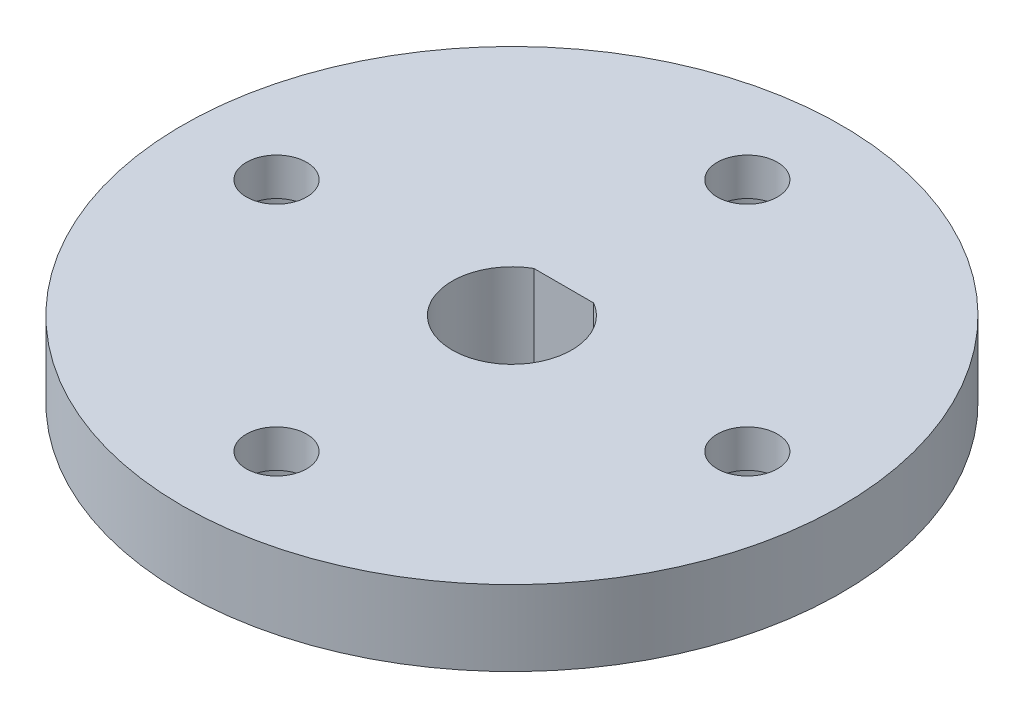
ISO-10303-21;
HEADER;
FILE_DESCRIPTION(('STEP AP214'),'2;1');
FILE_NAME('part.step','',(''),(''),'','','');
FILE_SCHEMA(('AUTOMOTIVE_DESIGN { 1 0 10303 214 1 1 1 1 }'));
ENDSEC;
DATA;
#1=APPLICATION_CONTEXT('core data for automotive mechanical design processes');
#2=APPLICATION_PROTOCOL_DEFINITION('international standard','automotive_design',2000,#1);
#3=PRODUCT_CONTEXT('',#1,'mechanical');
#4=PRODUCT('Part','Part','',(#3));
#5=PRODUCT_RELATED_PRODUCT_CATEGORY('part','',(#4));
#6=PRODUCT_DEFINITION_FORMATION('','',#4);
#7=PRODUCT_DEFINITION_CONTEXT('part definition',#1,'design');
#8=PRODUCT_DEFINITION('design','',#6,#7);
#9=PRODUCT_DEFINITION_SHAPE('','',#8);
#10=(LENGTH_UNIT() NAMED_UNIT(*) SI_UNIT(.MILLI.,.METRE.));
#11=(NAMED_UNIT(*) PLANE_ANGLE_UNIT() SI_UNIT($,.RADIAN.));
#12=(NAMED_UNIT(*) SI_UNIT($,.STERADIAN.) SOLID_ANGLE_UNIT());
#13=UNCERTAINTY_MEASURE_WITH_UNIT(LENGTH_MEASURE(1.E-05),#10,'distance_accuracy_value','');
#14=(GEOMETRIC_REPRESENTATION_CONTEXT(3) GLOBAL_UNCERTAINTY_ASSIGNED_CONTEXT((#13)) GLOBAL_UNIT_ASSIGNED_CONTEXT((#10,
#11,#12)) REPRESENTATION_CONTEXT('',''));
#15=CARTESIAN_POINT('',(0.,0.,0.));
#16=DIRECTION('',(0.,0.,1.));
#17=DIRECTION('',(1.,0.,0.));
#18=AXIS2_PLACEMENT_3D('',#15,#16,#17);
#19=CARTESIAN_POINT('',(-1.5875,-6.,-2.74963065701559));
#20=DIRECTION('',(0.,0.,-1.));
#21=DIRECTION('',(-1.,0.,0.));
#22=AXIS2_PLACEMENT_3D('',#19,#20,#21);
#23=PLANE('',#22);
#24=DIRECTION('',(0.,1.,0.));
#25=VECTOR('',#24,1.);
#26=CARTESIAN_POINT('',(-1.5875,-6.,-2.74963065701559));
#27=LINE('',#26,#25);
#28=CARTESIAN_POINT('',(-1.5875,-1.62528412026339,-2.74963065701559));
#29=VERTEX_POINT('',#28);
#30=CARTESIAN_POINT('',(-1.5875,4.,-2.74963065701559));
#31=VERTEX_POINT('',#30);
#32=EDGE_CURVE('E120',#29,#31,#27,.T.);
#33=ORIENTED_EDGE('',*,*,#32,.F.);
#34=CARTESIAN_POINT('',(0.,-3.,-2.74963065701559));
#35=DIRECTION('',(0.,0.,-1.));
#36=DIRECTION('',(-1.,0.,0.));
#37=AXIS2_PLACEMENT_3D('',#34,#35,#36);
#38=CIRCLE('',#37,2.1);
#39=CARTESIAN_POINT('',(1.5875,-1.62528412026339,-2.74963065701559));
#40=VERTEX_POINT('',#39);
#41=EDGE_CURVE('E112',#29,#40,#38,.T.);
#42=ORIENTED_EDGE('',*,*,#41,.T.);
#43=DIRECTION('',(0.,1.,0.));
#44=VECTOR('',#43,1.);
#45=CARTESIAN_POINT('',(1.5875,-6.,-2.74963065701559));
#46=LINE('',#45,#44);
#47=CARTESIAN_POINT('',(1.5875,4.,-2.74963065701559));
#48=VERTEX_POINT('',#47);
#49=EDGE_CURVE('E74',#40,#48,#46,.T.);
#50=ORIENTED_EDGE('',*,*,#49,.T.);
#51=DIRECTION('',(-1.,0.,0.));
#52=VECTOR('',#51,1.);
#53=CARTESIAN_POINT('',(-1.5875,4.,-2.74963065701559));
#54=LINE('',#53,#52);
#55=EDGE_CURVE('E141',#48,#31,#54,.T.);
#56=ORIENTED_EDGE('',*,*,#55,.T.);
#57=EDGE_LOOP('',(#33,#42,#50,#56));
#58=FACE_BOUND('',#57,.T.);
#59=ADVANCED_FACE('F47',(#58),#23,.F.);
#60=CARTESIAN_POINT('',(0.,4.,0.));
#61=DIRECTION('',(0.,-1.,0.));
#62=DIRECTION('',(0.,0.,-1.));
#63=AXIS2_PLACEMENT_3D('',#60,#61,#62);
#64=CYLINDRICAL_SURFACE('',#63,17.5);
#65=CARTESIAN_POINT('',(0.,4.,0.));
#66=DIRECTION('',(0.,1.,0.));
#67=DIRECTION('',(0.,0.,1.));
#68=AXIS2_PLACEMENT_3D('',#65,#66,#67);
#69=CIRCLE('',#68,17.5);
#70=CARTESIAN_POINT('',(0.,4.,17.5));
#71=VERTEX_POINT('',#70);
#72=EDGE_CURVE('E113',#71,#71,#69,.T.);
#73=ORIENTED_EDGE('',*,*,#72,.F.);
#74=EDGE_LOOP('',(#73));
#75=FACE_BOUND('',#74,.T.);
#76=CARTESIAN_POINT('',(0.,0.,0.));
#77=DIRECTION('',(0.,1.,0.));
#78=DIRECTION('',(0.,0.,1.));
#79=AXIS2_PLACEMENT_3D('',#76,#77,#78);
#80=CIRCLE('',#79,17.5);
#81=CARTESIAN_POINT('',(0.,0.,17.5));
#82=VERTEX_POINT('',#81);
#83=EDGE_CURVE('E177',#82,#82,#80,.T.);
#84=ORIENTED_EDGE('',*,*,#83,.T.);
#85=EDGE_LOOP('',(#84));
#86=FACE_BOUND('',#85,.T.);
#87=ADVANCED_FACE('F247',(#75,#86),#64,.T.);
#88=CARTESIAN_POINT('',(0.,4.,0.));
#89=DIRECTION('',(0.,1.,0.));
#90=DIRECTION('',(0.,0.,1.));
#91=AXIS2_PLACEMENT_3D('',#88,#89,#90);
#92=PLANE('',#91);
#93=CARTESIAN_POINT('',(0.,4.,-12.5));
#94=DIRECTION('',(0.,1.,0.));
#95=DIRECTION('',(0.,0.,1.));
#96=AXIS2_PLACEMENT_3D('',#93,#94,#95);
#97=CIRCLE('',#96,1.6);
#98=CARTESIAN_POINT('',(0.,4.,-10.9));
#99=VERTEX_POINT('',#98);
#100=EDGE_CURVE('E151',#99,#99,#97,.T.);
#101=ORIENTED_EDGE('',*,*,#100,.F.);
#102=EDGE_LOOP('',(#101));
#103=FACE_BOUND('',#102,.T.);
#104=CARTESIAN_POINT('',(0.,4.,0.));
#105=DIRECTION('',(0.,1.,0.));
#106=DIRECTION('',(0.,0.,1.));
#107=AXIS2_PLACEMENT_3D('',#104,#105,#106);
#108=CIRCLE('',#107,3.175);
#109=EDGE_CURVE('E144',#31,#48,#108,.T.);
#110=ORIENTED_EDGE('',*,*,#109,.F.);
#111=ORIENTED_EDGE('',*,*,#55,.F.);
#112=EDGE_LOOP('',(#110,#111));
#113=FACE_BOUND('',#112,.T.);
#114=CARTESIAN_POINT('',(-12.5,4.,0.));
#115=DIRECTION('',(0.,1.,0.));
#116=DIRECTION('',(0.,0.,1.));
#117=AXIS2_PLACEMENT_3D('',#114,#115,#116);
#118=CIRCLE('',#117,1.6);
#119=CARTESIAN_POINT('',(-12.5,4.,1.6));
#120=VERTEX_POINT('',#119);
#121=EDGE_CURVE('E135',#120,#120,#118,.T.);
#122=ORIENTED_EDGE('',*,*,#121,.F.);
#123=EDGE_LOOP('',(#122));
#124=FACE_BOUND('',#123,.T.);
#125=CARTESIAN_POINT('',(0.,4.,12.5));
#126=DIRECTION('',(0.,1.,0.));
#127=DIRECTION('',(0.,0.,1.));
#128=AXIS2_PLACEMENT_3D('',#125,#126,#127);
#129=CIRCLE('',#128,1.6);
#130=CARTESIAN_POINT('',(0.,4.,14.1));
#131=VERTEX_POINT('',#130);
#132=EDGE_CURVE('E152',#131,#131,#129,.T.);
#133=ORIENTED_EDGE('',*,*,#132,.F.);
#134=EDGE_LOOP('',(#133));
#135=FACE_BOUND('',#134,.T.);
#136=CARTESIAN_POINT('',(12.5,4.,0.));
#137=DIRECTION('',(0.,1.,0.));
#138=DIRECTION('',(0.,0.,1.));
#139=AXIS2_PLACEMENT_3D('',#136,#137,#138);
#140=CIRCLE('',#139,1.6);
#141=CARTESIAN_POINT('',(12.5,4.,1.6));
#142=VERTEX_POINT('',#141);
#143=EDGE_CURVE('E147',#142,#142,#140,.T.);
#144=ORIENTED_EDGE('',*,*,#143,.F.);
#145=EDGE_LOOP('',(#144));
#146=FACE_BOUND('',#145,.T.);
#147=ORIENTED_EDGE('',*,*,#72,.T.);
#148=EDGE_LOOP('',(#147));
#149=FACE_BOUND('',#148,.T.);
#150=ADVANCED_FACE('F253',(#103,#113,#124,#135,#146,#149),#92,.T.);
#151=CARTESIAN_POINT('',(0.,0.,0.));
#152=DIRECTION('',(0.,1.,0.));
#153=DIRECTION('',(0.,0.,1.));
#154=AXIS2_PLACEMENT_3D('',#151,#152,#153);
#155=PLANE('',#154);
#156=CARTESIAN_POINT('',(0.,0.,-12.5));
#157=DIRECTION('',(0.,1.,0.));
#158=DIRECTION('',(0.,0.,1.));
#159=AXIS2_PLACEMENT_3D('',#156,#157,#158);
#160=CIRCLE('',#159,3.);
#161=CARTESIAN_POINT('',(0.,0.,-9.5));
#162=VERTEX_POINT('',#161);
#163=EDGE_CURVE('E289',#162,#162,#160,.T.);
#164=ORIENTED_EDGE('',*,*,#163,.T.);
#165=EDGE_LOOP('',(#164));
#166=FACE_BOUND('',#165,.T.);
#167=CARTESIAN_POINT('',(12.5,0.,0.));
#168=DIRECTION('',(0.,1.,0.));
#169=DIRECTION('',(0.,0.,1.));
#170=AXIS2_PLACEMENT_3D('',#167,#168,#169);
#171=CIRCLE('',#170,3.);
#172=CARTESIAN_POINT('',(12.5,0.,3.));
#173=VERTEX_POINT('',#172);
#174=EDGE_CURVE('E293',#173,#173,#171,.T.);
#175=ORIENTED_EDGE('',*,*,#174,.T.);
#176=EDGE_LOOP('',(#175));
#177=FACE_BOUND('',#176,.T.);
#178=CARTESIAN_POINT('',(0.,0.,12.5));
#179=DIRECTION('',(0.,1.,0.));
#180=DIRECTION('',(0.,0.,1.));
#181=AXIS2_PLACEMENT_3D('',#178,#179,#180);
#182=CIRCLE('',#181,3.);
#183=CARTESIAN_POINT('',(0.,0.,15.5));
#184=VERTEX_POINT('',#183);
#185=EDGE_CURVE('E297',#184,#184,#182,.T.);
#186=ORIENTED_EDGE('',*,*,#185,.T.);
#187=EDGE_LOOP('',(#186));
#188=FACE_BOUND('',#187,.T.);
#189=CARTESIAN_POINT('',(-12.5,0.,0.));
#190=DIRECTION('',(0.,1.,0.));
#191=DIRECTION('',(0.,0.,1.));
#192=AXIS2_PLACEMENT_3D('',#189,#190,#191);
#193=CIRCLE('',#192,3.);
#194=CARTESIAN_POINT('',(-12.5,0.,3.));
#195=VERTEX_POINT('',#194);
#196=EDGE_CURVE('E301',#195,#195,#193,.T.);
#197=ORIENTED_EDGE('',*,*,#196,.T.);
#198=EDGE_LOOP('',(#197));
#199=FACE_BOUND('',#198,.T.);
#200=DIRECTION('',(-1.,0.,0.));
#201=VECTOR('',#200,1.);
#202=CARTESIAN_POINT('',(-2.87,0.,-6.9291485768455));
#203=LINE('',#202,#201);
#204=CARTESIAN_POINT('',(2.87,0.,-6.9291485768455));
#205=VERTEX_POINT('',#204);
#206=CARTESIAN_POINT('',(-2.87,0.,-6.9291485768455));
#207=VERTEX_POINT('',#206);
#208=EDGE_CURVE('E161',#205,#207,#203,.T.);
#209=ORIENTED_EDGE('',*,*,#208,.T.);
#210=CARTESIAN_POINT('',(0.,0.,0.));
#211=DIRECTION('',(0.,1.,0.));
#212=DIRECTION('',(0.,0.,1.));
#213=AXIS2_PLACEMENT_3D('',#210,#211,#212);
#214=CIRCLE('',#213,7.5);
#215=EDGE_CURVE('E166',#207,#205,#214,.T.);
#216=ORIENTED_EDGE('',*,*,#215,.T.);
#217=EDGE_LOOP('',(#209,#216));
#218=FACE_BOUND('',#217,.T.);
#219=ORIENTED_EDGE('',*,*,#83,.F.);
#220=EDGE_LOOP('',(#219));
#221=FACE_BOUND('',#220,.T.);
#222=ADVANCED_FACE('F277',(#166,#177,#188,#199,#218,#221),#155,.F.);
#223=CARTESIAN_POINT('',(0.,-6.,0.));
#224=DIRECTION('',(0.,1.,0.));
#225=DIRECTION('',(0.,0.,1.));
#226=AXIS2_PLACEMENT_3D('',#223,#224,#225);
#227=CYLINDRICAL_SURFACE('',#226,7.5);
#228=ORIENTED_EDGE('',*,*,#215,.F.);
#229=DIRECTION('',(0.,1.,0.));
#230=VECTOR('',#229,1.);
#231=CARTESIAN_POINT('',(-2.87,-6.,-6.9291485768455));
#232=LINE('',#231,#230);
#233=CARTESIAN_POINT('',(-2.87,-6.,-6.9291485768455));
#234=VERTEX_POINT('',#233);
#235=EDGE_CURVE('E173',#234,#207,#232,.T.);
#236=ORIENTED_EDGE('',*,*,#235,.F.);
#237=CARTESIAN_POINT('',(0.,-6.,0.));
#238=DIRECTION('',(0.,1.,0.));
#239=DIRECTION('',(0.,0.,1.));
#240=AXIS2_PLACEMENT_3D('',#237,#238,#239);
#241=CIRCLE('',#240,7.5);
#242=CARTESIAN_POINT('',(2.87,-6.,-6.9291485768455));
#243=VERTEX_POINT('',#242);
#244=EDGE_CURVE('E156',#234,#243,#241,.T.);
#245=ORIENTED_EDGE('',*,*,#244,.T.);
#246=DIRECTION('',(0.,1.,0.));
#247=VECTOR('',#246,1.);
#248=CARTESIAN_POINT('',(2.87,-6.,-6.9291485768455));
#249=LINE('',#248,#247);
#250=EDGE_CURVE('E165',#243,#205,#249,.T.);
#251=ORIENTED_EDGE('',*,*,#250,.T.);
#252=EDGE_LOOP('',(#228,#236,#245,#251));
#253=FACE_BOUND('',#252,.T.);
#254=ADVANCED_FACE('F270',(#253),#227,.T.);
#255=CARTESIAN_POINT('',(-2.87,-6.,-6.9291485768455));
#256=DIRECTION('',(0.,0.,-1.));
#257=DIRECTION('',(-1.,0.,0.));
#258=AXIS2_PLACEMENT_3D('',#255,#256,#257);
#259=PLANE('',#258);
#260=CARTESIAN_POINT('',(0.,-3.,-6.9291485768455));
#261=DIRECTION('',(0.,0.,-1.));
#262=DIRECTION('',(-1.,0.,0.));
#263=AXIS2_PLACEMENT_3D('',#260,#261,#262);
#264=CIRCLE('',#263,2.59999999999999);
#265=CARTESIAN_POINT('',(-2.59999999999999,-3.,-6.9291485768455));
#266=VERTEX_POINT('',#265);
#267=EDGE_CURVE('E11',#266,#266,#264,.F.);
#268=ORIENTED_EDGE('',*,*,#267,.T.);
#269=EDGE_LOOP('',(#268));
#270=FACE_BOUND('',#269,.T.);
#271=ORIENTED_EDGE('',*,*,#208,.F.);
#272=ORIENTED_EDGE('',*,*,#250,.F.);
#273=DIRECTION('',(-1.,0.,0.));
#274=VECTOR('',#273,1.);
#275=CARTESIAN_POINT('',(-2.87,-6.,-6.9291485768455));
#276=LINE('',#275,#274);
#277=EDGE_CURVE('E160',#243,#234,#276,.T.);
#278=ORIENTED_EDGE('',*,*,#277,.T.);
#279=ORIENTED_EDGE('',*,*,#235,.T.);
#280=EDGE_LOOP('',(#271,#272,#278,#279));
#281=FACE_BOUND('',#280,.T.);
#282=ADVANCED_FACE('F264',(#270,#281),#259,.T.);
#283=CARTESIAN_POINT('',(0.,-6.,0.));
#284=DIRECTION('',(0.,1.,0.));
#285=DIRECTION('',(0.,0.,1.));
#286=AXIS2_PLACEMENT_3D('',#283,#284,#285);
#287=PLANE('',#286);
#288=DIRECTION('',(-1.,0.,0.));
#289=VECTOR('',#288,1.);
#290=CARTESIAN_POINT('',(-1.5875,-6.,-2.74963065701559));
#291=LINE('',#290,#289);
#292=CARTESIAN_POINT('',(1.5875,-6.,-2.74963065701559));
#293=VERTEX_POINT('',#292);
#294=CARTESIAN_POINT('',(-1.5875,-6.,-2.74963065701559));
#295=VERTEX_POINT('',#294);
#296=EDGE_CURVE('E124',#293,#295,#291,.T.);
#297=ORIENTED_EDGE('',*,*,#296,.T.);
#298=CARTESIAN_POINT('',(0.,-6.,0.));
#299=DIRECTION('',(0.,1.,0.));
#300=DIRECTION('',(0.,0.,1.));
#301=AXIS2_PLACEMENT_3D('',#298,#299,#300);
#302=CIRCLE('',#301,3.175);
#303=EDGE_CURVE('E130',#295,#293,#302,.T.);
#304=ORIENTED_EDGE('',*,*,#303,.T.);
#305=EDGE_LOOP('',(#297,#304));
#306=FACE_BOUND('',#305,.T.);
#307=ORIENTED_EDGE('',*,*,#244,.F.);
#308=ORIENTED_EDGE('',*,*,#277,.F.);
#309=EDGE_LOOP('',(#307,#308));
#310=FACE_BOUND('',#309,.T.);
#311=ADVANCED_FACE('F261',(#306,#310),#287,.F.);
#312=CARTESIAN_POINT('',(0.,-6.,0.));
#313=DIRECTION('',(0.,1.,0.));
#314=DIRECTION('',(0.,0.,1.));
#315=AXIS2_PLACEMENT_3D('',#312,#313,#314);
#316=CYLINDRICAL_SURFACE('',#315,3.175);
#317=ORIENTED_EDGE('',*,*,#49,.F.);
#318=CARTESIAN_POINT('',(1.5875,-1.62528412026339,-2.74963065701559));
#319=CARTESIAN_POINT('',(1.62410973291812,-1.66757572578731,-2.72849586889465));
#320=CARTESIAN_POINT('',(1.65902386075673,-1.71129396295769,-2.70736051748151));
#321=CARTESIAN_POINT('',(1.72538077800469,-1.80157812127435,-2.66556282522172));
#322=CARTESIAN_POINT('',(1.75682006040696,-1.84814684697451,-2.64490097863079));
#323=CARTESIAN_POINT('',(1.84618209170187,-1.99276891435618,-2.58407451976342));
#324=CARTESIAN_POINT('',(1.89854868542722,-2.09504827891069,-2.54542940536462));
#325=CARTESIAN_POINT('',(1.97869671938612,-2.29020752669162,-2.48344313905968));
#326=CARTESIAN_POINT('',(2.00920122153948,-2.38149186292796,-2.45860075631591));
#327=CARTESIAN_POINT('',(2.05757413567829,-2.56906136237515,-2.41826689796556));
#328=CARTESIAN_POINT('',(2.07549230248983,-2.66532520108733,-2.40273863885549));
#329=CARTESIAN_POINT('',(2.09775875804727,-2.86141382778748,-2.38333239240396));
#330=CARTESIAN_POINT('',(2.10199903634917,-2.96126069376848,-2.37954714524535));
#331=CARTESIAN_POINT('',(2.0962427380215,-3.16025477333758,-2.38461762929848));
#332=CARTESIAN_POINT('',(2.08623894374288,-3.25940160662221,-2.39347976910401));
#333=CARTESIAN_POINT('',(2.05447161116667,-3.44388225220181,-2.42077266070863));
#334=CARTESIAN_POINT('',(2.03398650241046,-3.52960483849625,-2.43815593770215));
#335=CARTESIAN_POINT('',(1.9830831290022,-3.69642600809741,-2.47973503000094));
#336=CARTESIAN_POINT('',(1.95264517168921,-3.77751504673905,-2.50394433807507));
#337=CARTESIAN_POINT('',(1.87505054425611,-3.95138716359832,-2.56274424661761));
#338=CARTESIAN_POINT('',(1.82568816586358,-4.04281251726662,-2.59844693518846));
#339=CARTESIAN_POINT('',(1.74275107933,-4.17279395898369,-2.65415743550603));
#340=CARTESIAN_POINT('',(1.71370682510952,-4.21483201517944,-2.67303709961556));
#341=CARTESIAN_POINT('',(1.65274205990583,-4.29654647417554,-2.71115475317146));
#342=CARTESIAN_POINT('',(1.62082353573466,-4.3362244773123,-2.73039248791775));
#343=CARTESIAN_POINT('',(1.5875,-4.37471587973661,-2.74963065701559));
#344=B_SPLINE_CURVE_WITH_KNOTS('',3,(#318,#319,#320,#321,#322,#323,#324,#325,#326,#327,#328,
#329,#330,#331,#332,#333,#334,#335,#336,#337,#338,#339,#340,#341,#342,#343),.UNSPECIFIED.,.F.,
.F.,(4,2,2,2,2,2,2,2,2,2,2,2,4),(0.,0.179284724713041,0.358748772351814,0.720596117571245,
1.01766054436381,1.31354393972753,1.61175819536206,1.91012361366216,2.17860008537431,
2.44761101068217,2.77586826035375,2.93918158838189,3.10238288168606),.UNSPECIFIED.);
#345=CARTESIAN_POINT('',(1.5875,-4.37471587973661,-2.74963065701559));
#346=VERTEX_POINT('',#345);
#347=EDGE_CURVE('E106',#40,#346,#344,.T.);
#348=ORIENTED_EDGE('',*,*,#347,.T.);
#349=EDGE_CURVE('E117',#293,#346,#46,.T.);
#350=ORIENTED_EDGE('',*,*,#349,.F.);
#351=ORIENTED_EDGE('',*,*,#303,.F.);
#352=CARTESIAN_POINT('',(-1.5875,-4.37471587973661,-2.74963065701559));
#353=VERTEX_POINT('',#352);
#354=EDGE_CURVE('E132',#295,#353,#27,.T.);
#355=ORIENTED_EDGE('',*,*,#354,.T.);
#356=CARTESIAN_POINT('',(-1.5875,-4.37471587973661,-2.74963065701559));
#357=CARTESIAN_POINT('',(-1.62410973291812,-4.33242427421269,-2.72849586889465));
#358=CARTESIAN_POINT('',(-1.65902386075673,-4.28870603704231,-2.70736051748151));
#359=CARTESIAN_POINT('',(-1.72538077800469,-4.19842187872565,-2.66556282522172));
#360=CARTESIAN_POINT('',(-1.75682006040696,-4.15185315302549,-2.64490097863079));
#361=CARTESIAN_POINT('',(-1.84618209170187,-4.00723108564382,-2.58407451976342));
#362=CARTESIAN_POINT('',(-1.89854868542722,-3.90495172108931,-2.54542940536462));
#363=CARTESIAN_POINT('',(-1.97869671938612,-3.70979247330838,-2.48344313905968));
#364=CARTESIAN_POINT('',(-2.00920122153948,-3.61850813707204,-2.45860075631591));
#365=CARTESIAN_POINT('',(-2.05757413567829,-3.43093863762485,-2.41826689796556));
#366=CARTESIAN_POINT('',(-2.07549230248983,-3.33467479891267,-2.40273863885549));
#367=CARTESIAN_POINT('',(-2.09775875804727,-3.13858617221252,-2.38333239240396));
#368=CARTESIAN_POINT('',(-2.10199903634917,-3.03873930623151,-2.37954714524535));
#369=CARTESIAN_POINT('',(-2.0962427380215,-2.83974522666242,-2.38461762929848));
#370=CARTESIAN_POINT('',(-2.08623894374288,-2.74059839337779,-2.39347976910401));
#371=CARTESIAN_POINT('',(-2.05447161116667,-2.55611774779819,-2.42077266070863));
#372=CARTESIAN_POINT('',(-2.03398650241046,-2.47039516150375,-2.43815593770215));
#373=CARTESIAN_POINT('',(-1.9830831290022,-2.30357399190259,-2.47973503000094));
#374=CARTESIAN_POINT('',(-1.95264517168921,-2.22248495326095,-2.50394433807507));
#375=CARTESIAN_POINT('',(-1.87505054425611,-2.04861283640168,-2.56274424661761));
#376=CARTESIAN_POINT('',(-1.82568816586358,-1.95718748273338,-2.59844693518846));
#377=CARTESIAN_POINT('',(-1.74275107933001,-1.82720604101631,-2.65415743550603));
#378=CARTESIAN_POINT('',(-1.71370682510952,-1.78516798482056,-2.67303709961556));
#379=CARTESIAN_POINT('',(-1.65274205990583,-1.70345352582446,-2.71115475317146));
#380=CARTESIAN_POINT('',(-1.62082353573466,-1.6637755226877,-2.73039248791775));
#381=CARTESIAN_POINT('',(-1.5875,-1.62528412026339,-2.74963065701559));
#382=B_SPLINE_CURVE_WITH_KNOTS('',3,(#356,#357,#358,#359,#360,#361,#362,#363,#364,#365,#366,
#367,#368,#369,#370,#371,#372,#373,#374,#375,#376,#377,#378,#379,#380,#381),.UNSPECIFIED.,.F.,
.F.,(4,2,2,2,2,2,2,2,2,2,2,2,4),(0.,0.17928472471304,0.358748772351815,0.720596117571245,
1.01766054436381,1.31354393972753,1.61175819536206,1.91012361366216,2.17860008537431,
2.44761101068217,2.77586826035374,2.93918158838189,3.10238288168606),.UNSPECIFIED.);
#383=EDGE_CURVE('E66',#353,#29,#382,.T.);
#384=ORIENTED_EDGE('',*,*,#383,.T.);
#385=ORIENTED_EDGE('',*,*,#32,.T.);
#386=ORIENTED_EDGE('',*,*,#109,.T.);
#387=EDGE_LOOP('',(#317,#348,#350,#351,#355,#384,#385,#386));
#388=FACE_BOUND('',#387,.T.);
#389=ADVANCED_FACE('F116',(#388),#316,.F.);
#390=ORIENTED_EDGE('',*,*,#349,.T.);
#391=EDGE_CURVE('E103',#346,#353,#38,.T.);
#392=ORIENTED_EDGE('',*,*,#391,.T.);
#393=ORIENTED_EDGE('',*,*,#354,.F.);
#394=ORIENTED_EDGE('',*,*,#296,.F.);
#395=EDGE_LOOP('',(#390,#392,#393,#394));
#396=FACE_BOUND('',#395,.T.);
#397=ADVANCED_FACE('F122',(#396),#23,.F.);
#398=CARTESIAN_POINT('',(12.5,-6.,0.));
#399=DIRECTION('',(0.,1.,0.));
#400=DIRECTION('',(0.,0.,1.));
#401=AXIS2_PLACEMENT_3D('',#398,#399,#400);
#402=CYLINDRICAL_SURFACE('',#401,1.6);
#403=CARTESIAN_POINT('',(12.5,2.,0.));
#404=DIRECTION('',(0.,1.,0.));
#405=DIRECTION('',(0.,0.,1.));
#406=AXIS2_PLACEMENT_3D('',#403,#404,#405);
#407=CIRCLE('',#406,1.6);
#408=CARTESIAN_POINT('',(12.5,2.,1.6));
#409=VERTEX_POINT('',#408);
#410=EDGE_CURVE('E52',#409,#409,#407,.F.);
#411=ORIENTED_EDGE('',*,*,#410,.T.);
#412=EDGE_LOOP('',(#411));
#413=FACE_BOUND('',#412,.T.);
#414=ORIENTED_EDGE('',*,*,#143,.T.);
#415=EDGE_LOOP('',(#414));
#416=FACE_BOUND('',#415,.T.);
#417=ADVANCED_FACE('F243',(#413,#416),#402,.F.);
#418=CARTESIAN_POINT('',(0.,-6.,12.5));
#419=DIRECTION('',(0.,1.,0.));
#420=DIRECTION('',(0.,0.,1.));
#421=AXIS2_PLACEMENT_3D('',#418,#419,#420);
#422=CYLINDRICAL_SURFACE('',#421,1.6);
#423=CARTESIAN_POINT('',(0.,2.,12.5));
#424=DIRECTION('',(0.,1.,0.));
#425=DIRECTION('',(0.,0.,1.));
#426=AXIS2_PLACEMENT_3D('',#423,#424,#425);
#427=CIRCLE('',#426,1.6);
#428=CARTESIAN_POINT('',(0.,2.,14.1));
#429=VERTEX_POINT('',#428);
#430=EDGE_CURVE('E197',#429,#429,#427,.F.);
#431=ORIENTED_EDGE('',*,*,#430,.T.);
#432=EDGE_LOOP('',(#431));
#433=FACE_BOUND('',#432,.T.);
#434=ORIENTED_EDGE('',*,*,#132,.T.);
#435=EDGE_LOOP('',(#434));
#436=FACE_BOUND('',#435,.T.);
#437=ADVANCED_FACE('F238',(#433,#436),#422,.F.);
#438=CARTESIAN_POINT('',(-12.5,-6.,0.));
#439=DIRECTION('',(0.,1.,0.));
#440=DIRECTION('',(0.,0.,1.));
#441=AXIS2_PLACEMENT_3D('',#438,#439,#440);
#442=CYLINDRICAL_SURFACE('',#441,1.6);
#443=CARTESIAN_POINT('',(-12.5,2.,0.));
#444=DIRECTION('',(0.,1.,0.));
#445=DIRECTION('',(0.,0.,1.));
#446=AXIS2_PLACEMENT_3D('',#443,#444,#445);
#447=CIRCLE('',#446,1.6);
#448=CARTESIAN_POINT('',(-12.5,2.,1.6));
#449=VERTEX_POINT('',#448);
#450=EDGE_CURVE('E193',#449,#449,#447,.F.);
#451=ORIENTED_EDGE('',*,*,#450,.T.);
#452=EDGE_LOOP('',(#451));
#453=FACE_BOUND('',#452,.T.);
#454=ORIENTED_EDGE('',*,*,#121,.T.);
#455=EDGE_LOOP('',(#454));
#456=FACE_BOUND('',#455,.T.);
#457=ADVANCED_FACE('F235',(#453,#456),#442,.F.);
#458=CARTESIAN_POINT('',(0.,-6.,-12.5));
#459=DIRECTION('',(0.,1.,0.));
#460=DIRECTION('',(0.,0.,1.));
#461=AXIS2_PLACEMENT_3D('',#458,#459,#460);
#462=CYLINDRICAL_SURFACE('',#461,1.6);
#463=CARTESIAN_POINT('',(0.,2.,-12.5));
#464=DIRECTION('',(0.,1.,0.));
#465=DIRECTION('',(0.,0.,1.));
#466=AXIS2_PLACEMENT_3D('',#463,#464,#465);
#467=CIRCLE('',#466,1.6);
#468=CARTESIAN_POINT('',(0.,2.,-10.9));
#469=VERTEX_POINT('',#468);
#470=EDGE_CURVE('E189',#469,#469,#467,.F.);
#471=ORIENTED_EDGE('',*,*,#470,.T.);
#472=EDGE_LOOP('',(#471));
#473=FACE_BOUND('',#472,.T.);
#474=ORIENTED_EDGE('',*,*,#100,.T.);
#475=EDGE_LOOP('',(#474));
#476=FACE_BOUND('',#475,.T.);
#477=ADVANCED_FACE('F229',(#473,#476),#462,.F.);
#478=CARTESIAN_POINT('',(0.,-3.,-1.74963065701559));
#479=DIRECTION('',(0.,0.,-1.));
#480=DIRECTION('',(-1.,0.,0.));
#481=AXIS2_PLACEMENT_3D('',#478,#479,#480);
#482=CYLINDRICAL_SURFACE('',#481,2.1);
#483=CARTESIAN_POINT('',(0.,-3.,-6.42914857684551));
#484=DIRECTION('',(0.,0.,-1.));
#485=DIRECTION('',(-1.,0.,0.));
#486=AXIS2_PLACEMENT_3D('',#483,#484,#485);
#487=CIRCLE('',#486,2.1);
#488=CARTESIAN_POINT('',(-2.1,-3.,-6.42914857684551));
#489=VERTEX_POINT('',#488);
#490=EDGE_CURVE('E58',#489,#489,#487,.T.);
#491=ORIENTED_EDGE('',*,*,#490,.T.);
#492=EDGE_LOOP('',(#491));
#493=FACE_BOUND('',#492,.T.);
#494=ORIENTED_EDGE('',*,*,#383,.F.);
#495=ORIENTED_EDGE('',*,*,#391,.F.);
#496=ORIENTED_EDGE('',*,*,#347,.F.);
#497=ORIENTED_EDGE('',*,*,#41,.F.);
#498=EDGE_LOOP('',(#494,#495,#496,#497));
#499=FACE_BOUND('',#498,.T.);
#500=ADVANCED_FACE('F105',(#493,#499),#482,.F.);
#501=CARTESIAN_POINT('',(0.,-3.,-6.42914857684551));
#502=DIRECTION('',(0.,0.,-1.));
#503=DIRECTION('',(-1.,0.,0.));
#504=AXIS2_PLACEMENT_3D('',#501,#502,#503);
#505=CONICAL_SURFACE('',#504,2.1,0.785398163397447);
#506=ORIENTED_EDGE('',*,*,#267,.F.);
#507=EDGE_LOOP('',(#506));
#508=FACE_BOUND('',#507,.T.);
#509=ORIENTED_EDGE('',*,*,#490,.F.);
#510=EDGE_LOOP('',(#509));
#511=FACE_BOUND('',#510,.T.);
#512=ADVANCED_FACE('F50',(#508,#511),#505,.F.);
#513=CARTESIAN_POINT('',(0.,2.,-12.5));
#514=DIRECTION('',(0.,1.,0.));
#515=DIRECTION('',(0.,0.,1.));
#516=AXIS2_PLACEMENT_3D('',#513,#514,#515);
#517=PLANE('',#516);
#518=CARTESIAN_POINT('',(0.,2.,-12.5));
#519=DIRECTION('',(0.,1.,0.));
#520=DIRECTION('',(0.,0.,1.));
#521=AXIS2_PLACEMENT_3D('',#518,#519,#520);
#522=CIRCLE('',#521,3.);
#523=CARTESIAN_POINT('',(0.,2.,-9.5));
#524=VERTEX_POINT('',#523);
#525=EDGE_CURVE('E194',#524,#524,#522,.T.);
#526=ORIENTED_EDGE('',*,*,#525,.F.);
#527=EDGE_LOOP('',(#526));
#528=FACE_BOUND('',#527,.T.);
#529=ORIENTED_EDGE('',*,*,#470,.F.);
#530=EDGE_LOOP('',(#529));
#531=FACE_BOUND('',#530,.T.);
#532=ADVANCED_FACE('F335',(#528,#531),#517,.F.);
#533=CARTESIAN_POINT('',(0.,2.,-12.5));
#534=DIRECTION('',(0.,-1.,0.));
#535=DIRECTION('',(0.,0.,-1.));
#536=AXIS2_PLACEMENT_3D('',#533,#534,#535);
#537=CYLINDRICAL_SURFACE('',#536,3.);
#538=ORIENTED_EDGE('',*,*,#525,.T.);
#539=EDGE_LOOP('',(#538));
#540=FACE_BOUND('',#539,.T.);
#541=ORIENTED_EDGE('',*,*,#163,.F.);
#542=EDGE_LOOP('',(#541));
#543=FACE_BOUND('',#542,.T.);
#544=ADVANCED_FACE('F332',(#540,#543),#537,.F.);
#545=CARTESIAN_POINT('',(-12.5,2.,0.));
#546=DIRECTION('',(0.,1.,0.));
#547=DIRECTION('',(0.,0.,1.));
#548=AXIS2_PLACEMENT_3D('',#545,#546,#547);
#549=PLANE('',#548);
#550=CARTESIAN_POINT('',(-12.5,2.,0.));
#551=DIRECTION('',(0.,1.,0.));
#552=DIRECTION('',(0.,0.,1.));
#553=AXIS2_PLACEMENT_3D('',#550,#551,#552);
#554=CIRCLE('',#553,3.);
#555=CARTESIAN_POINT('',(-12.5,2.,3.));
#556=VERTEX_POINT('',#555);
#557=EDGE_CURVE('E216',#556,#556,#554,.T.);
#558=ORIENTED_EDGE('',*,*,#557,.F.);
#559=EDGE_LOOP('',(#558));
#560=FACE_BOUND('',#559,.T.);
#561=ORIENTED_EDGE('',*,*,#450,.F.);
#562=EDGE_LOOP('',(#561));
#563=FACE_BOUND('',#562,.T.);
#564=ADVANCED_FACE('F231',(#560,#563),#549,.F.);
#565=CARTESIAN_POINT('',(-12.5,2.,0.));
#566=DIRECTION('',(0.,-1.,0.));
#567=DIRECTION('',(0.,0.,-1.));
#568=AXIS2_PLACEMENT_3D('',#565,#566,#567);
#569=CYLINDRICAL_SURFACE('',#568,3.);
#570=ORIENTED_EDGE('',*,*,#557,.T.);
#571=EDGE_LOOP('',(#570));
#572=FACE_BOUND('',#571,.T.);
#573=ORIENTED_EDGE('',*,*,#196,.F.);
#574=EDGE_LOOP('',(#573));
#575=FACE_BOUND('',#574,.T.);
#576=ADVANCED_FACE('F381',(#572,#575),#569,.F.);
#577=CARTESIAN_POINT('',(0.,2.,12.5));
#578=DIRECTION('',(0.,1.,0.));
#579=DIRECTION('',(0.,0.,1.));
#580=AXIS2_PLACEMENT_3D('',#577,#578,#579);
#581=PLANE('',#580);
#582=CARTESIAN_POINT('',(0.,2.,12.5));
#583=DIRECTION('',(0.,1.,0.));
#584=DIRECTION('',(0.,0.,1.));
#585=AXIS2_PLACEMENT_3D('',#582,#583,#584);
#586=CIRCLE('',#585,3.);
#587=CARTESIAN_POINT('',(0.,2.,15.5));
#588=VERTEX_POINT('',#587);
#589=EDGE_CURVE('E311',#588,#588,#586,.T.);
#590=ORIENTED_EDGE('',*,*,#589,.F.);
#591=EDGE_LOOP('',(#590));
#592=FACE_BOUND('',#591,.T.);
#593=ORIENTED_EDGE('',*,*,#430,.F.);
#594=EDGE_LOOP('',(#593));
#595=FACE_BOUND('',#594,.T.);
#596=ADVANCED_FACE('F378',(#592,#595),#581,.F.);
#597=CARTESIAN_POINT('',(0.,2.,12.5));
#598=DIRECTION('',(0.,-1.,0.));
#599=DIRECTION('',(0.,0.,-1.));
#600=AXIS2_PLACEMENT_3D('',#597,#598,#599);
#601=CYLINDRICAL_SURFACE('',#600,3.);
#602=ORIENTED_EDGE('',*,*,#589,.T.);
#603=EDGE_LOOP('',(#602));
#604=FACE_BOUND('',#603,.T.);
#605=ORIENTED_EDGE('',*,*,#185,.F.);
#606=EDGE_LOOP('',(#605));
#607=FACE_BOUND('',#606,.T.);
#608=ADVANCED_FACE('F374',(#604,#607),#601,.F.);
#609=CARTESIAN_POINT('',(12.5,2.,0.));
#610=DIRECTION('',(0.,1.,0.));
#611=DIRECTION('',(0.,0.,1.));
#612=AXIS2_PLACEMENT_3D('',#609,#610,#611);
#613=PLANE('',#612);
#614=CARTESIAN_POINT('',(12.5,2.,0.));
#615=DIRECTION('',(0.,1.,0.));
#616=DIRECTION('',(0.,0.,1.));
#617=AXIS2_PLACEMENT_3D('',#614,#615,#616);
#618=CIRCLE('',#617,3.);
#619=CARTESIAN_POINT('',(12.5,2.,3.));
#620=VERTEX_POINT('',#619);
#621=EDGE_CURVE('E320',#620,#620,#618,.T.);
#622=ORIENTED_EDGE('',*,*,#621,.F.);
#623=EDGE_LOOP('',(#622));
#624=FACE_BOUND('',#623,.T.);
#625=ORIENTED_EDGE('',*,*,#410,.F.);
#626=EDGE_LOOP('',(#625));
#627=FACE_BOUND('',#626,.T.);
#628=ADVANCED_FACE('F370',(#624,#627),#613,.F.);
#629=CARTESIAN_POINT('',(12.5,2.,0.));
#630=DIRECTION('',(0.,-1.,0.));
#631=DIRECTION('',(0.,0.,-1.));
#632=AXIS2_PLACEMENT_3D('',#629,#630,#631);
#633=CYLINDRICAL_SURFACE('',#632,3.);
#634=ORIENTED_EDGE('',*,*,#621,.T.);
#635=EDGE_LOOP('',(#634));
#636=FACE_BOUND('',#635,.T.);
#637=ORIENTED_EDGE('',*,*,#174,.F.);
#638=EDGE_LOOP('',(#637));
#639=FACE_BOUND('',#638,.T.);
#640=ADVANCED_FACE('F367',(#636,#639),#633,.F.);
#641=CLOSED_SHELL('',(#59,#87,#150,#222,#254,#282,#311,#389,#397,#417,#437,#457,#477,#500,#512,
#532,#544,#564,#576,#596,#608,#628,#640));
#642=MANIFOLD_SOLID_BREP('B2',#641);
#643=ADVANCED_BREP_SHAPE_REPRESENTATION('',(#18,#642),#14);
#644=SHAPE_DEFINITION_REPRESENTATION(#9,#643);
ENDSEC;
END-ISO-10303-21;
